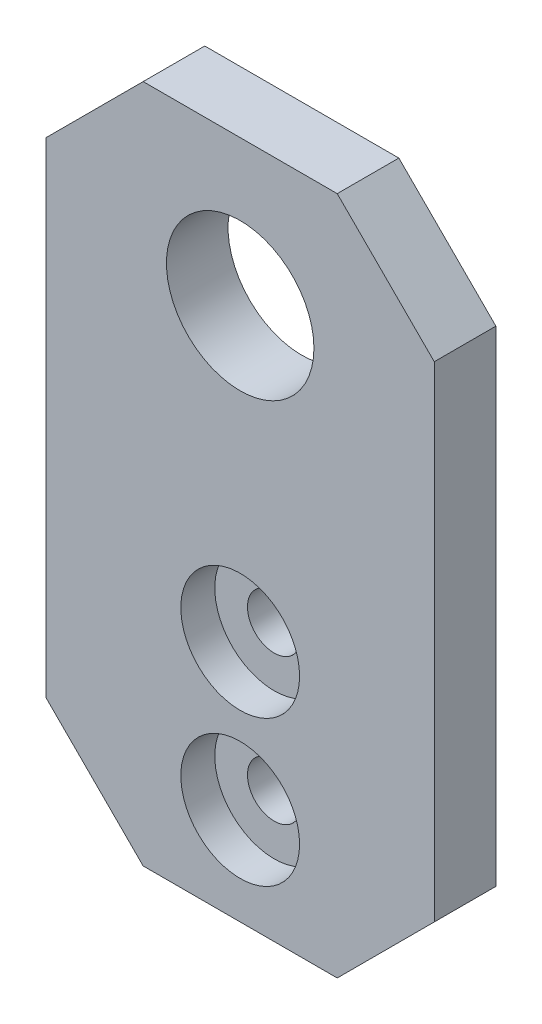
ISO-10303-21;
HEADER;
FILE_DESCRIPTION(('STEP AP214'),'2;1');
FILE_NAME('part.step','',(''),(''),'','','');
FILE_SCHEMA(('AUTOMOTIVE_DESIGN { 1 0 10303 214 1 1 1 1 }'));
ENDSEC;
DATA;
#1=APPLICATION_CONTEXT('core data for automotive mechanical design processes');
#2=APPLICATION_PROTOCOL_DEFINITION('international standard','automotive_design',2000,#1);
#3=PRODUCT_CONTEXT('',#1,'mechanical');
#4=PRODUCT('Part','Part','',(#3));
#5=PRODUCT_RELATED_PRODUCT_CATEGORY('part','',(#4));
#6=PRODUCT_DEFINITION_FORMATION('','',#4);
#7=PRODUCT_DEFINITION_CONTEXT('part definition',#1,'design');
#8=PRODUCT_DEFINITION('design','',#6,#7);
#9=PRODUCT_DEFINITION_SHAPE('','',#8);
#10=(LENGTH_UNIT() NAMED_UNIT(*) SI_UNIT(.MILLI.,.METRE.));
#11=(NAMED_UNIT(*) PLANE_ANGLE_UNIT() SI_UNIT($,.RADIAN.));
#12=(NAMED_UNIT(*) SI_UNIT($,.STERADIAN.) SOLID_ANGLE_UNIT());
#13=UNCERTAINTY_MEASURE_WITH_UNIT(LENGTH_MEASURE(1.E-05),#10,'distance_accuracy_value','');
#14=(GEOMETRIC_REPRESENTATION_CONTEXT(3) GLOBAL_UNCERTAINTY_ASSIGNED_CONTEXT((#13)) GLOBAL_UNIT_ASSIGNED_CONTEXT((#10,
#11,#12)) REPRESENTATION_CONTEXT('',''));
#15=CARTESIAN_POINT('',(0.,0.,0.));
#16=DIRECTION('',(0.,0.,1.));
#17=DIRECTION('',(1.,0.,0.));
#18=AXIS2_PLACEMENT_3D('',#15,#16,#17);
#19=CARTESIAN_POINT('',(0.,0.,6.35));
#20=DIRECTION('',(0.,0.,-1.));
#21=DIRECTION('',(-1.,0.,0.));
#22=AXIS2_PLACEMENT_3D('',#19,#20,#21);
#23=PLANE('',#22);
#24=CARTESIAN_POINT('',(0.,-10.,6.35));
#25=DIRECTION('',(0.,0.,1.));
#26=DIRECTION('',(1.,0.,0.));
#27=AXIS2_PLACEMENT_3D('',#24,#25,#26);
#28=CIRCLE('',#27,6.119);
#29=CARTESIAN_POINT('',(6.119,-10.,6.35));
#30=VERTEX_POINT('',#29);
#31=EDGE_CURVE('E214',#30,#30,#28,.T.);
#32=ORIENTED_EDGE('',*,*,#31,.F.);
#33=EDGE_LOOP('',(#32));
#34=FACE_BOUND('',#33,.T.);
#35=DIRECTION('',(1.,0.,0.));
#36=VECTOR('',#35,1.);
#37=CARTESIAN_POINT('',(-20.,-35.,6.35));
#38=LINE('',#37,#36);
#39=CARTESIAN_POINT('',(-10.,-35.,6.35));
#40=VERTEX_POINT('',#39);
#41=CARTESIAN_POINT('',(9.99999999999997,-35.,6.35));
#42=VERTEX_POINT('',#41);
#43=EDGE_CURVE('E177',#40,#42,#38,.T.);
#44=ORIENTED_EDGE('',*,*,#43,.T.);
#45=DIRECTION('',(-0.707106781186549,-0.707106781186546,0.));
#46=VECTOR('',#45,1.);
#47=CARTESIAN_POINT('',(20.,-25.,6.35));
#48=LINE('',#47,#46);
#49=CARTESIAN_POINT('',(20.,-25.,6.35));
#50=VERTEX_POINT('',#49);
#51=EDGE_CURVE('E157',#42,#50,#48,.F.);
#52=ORIENTED_EDGE('',*,*,#51,.T.);
#53=DIRECTION('',(0.,1.,0.));
#54=VECTOR('',#53,1.);
#55=CARTESIAN_POINT('',(20.,-35.,6.35));
#56=LINE('',#55,#54);
#57=CARTESIAN_POINT('',(20.,24.9999999999999,6.35));
#58=VERTEX_POINT('',#57);
#59=EDGE_CURVE('E127',#50,#58,#56,.T.);
#60=ORIENTED_EDGE('',*,*,#59,.T.);
#61=DIRECTION('',(0.707106781186546,-0.707106781186549,0.));
#62=VECTOR('',#61,1.);
#63=CARTESIAN_POINT('',(9.99999999999999,35.,6.35));
#64=LINE('',#63,#62);
#65=CARTESIAN_POINT('',(9.99999999999999,35.,6.35));
#66=VERTEX_POINT('',#65);
#67=EDGE_CURVE('E63',#58,#66,#64,.F.);
#68=ORIENTED_EDGE('',*,*,#67,.T.);
#69=DIRECTION('',(-1.,0.,0.));
#70=VECTOR('',#69,1.);
#71=CARTESIAN_POINT('',(-20.,35.,6.35));
#72=LINE('',#71,#70);
#73=CARTESIAN_POINT('',(-9.99999999999995,35.,6.35));
#74=VERTEX_POINT('',#73);
#75=EDGE_CURVE('E144',#66,#74,#72,.T.);
#76=ORIENTED_EDGE('',*,*,#75,.T.);
#77=DIRECTION('',(0.707106781186549,0.707106781186546,0.));
#78=VECTOR('',#77,1.);
#79=CARTESIAN_POINT('',(-20.,25.,6.35));
#80=LINE('',#79,#78);
#81=CARTESIAN_POINT('',(-20.,25.,6.35));
#82=VERTEX_POINT('',#81);
#83=EDGE_CURVE('E152',#74,#82,#80,.F.);
#84=ORIENTED_EDGE('',*,*,#83,.T.);
#85=DIRECTION('',(0.,-1.,0.));
#86=VECTOR('',#85,1.);
#87=CARTESIAN_POINT('',(-20.,-35.,6.35));
#88=LINE('',#87,#86);
#89=CARTESIAN_POINT('',(-20.,-25.,6.35));
#90=VERTEX_POINT('',#89);
#91=EDGE_CURVE('E138',#82,#90,#88,.T.);
#92=ORIENTED_EDGE('',*,*,#91,.T.);
#93=DIRECTION('',(-0.707106781186546,0.707106781186549,0.));
#94=VECTOR('',#93,1.);
#95=CARTESIAN_POINT('',(-9.99999999999999,-35.,6.35));
#96=LINE('',#95,#94);
#97=EDGE_CURVE('E155',#90,#40,#96,.F.);
#98=ORIENTED_EDGE('',*,*,#97,.T.);
#99=EDGE_LOOP('',(#44,#52,#60,#68,#76,#84,#92,#98));
#100=FACE_BOUND('',#99,.T.);
#101=CARTESIAN_POINT('',(0.,20.,6.35));
#102=DIRECTION('',(0.,0.,1.));
#103=DIRECTION('',(1.,0.,0.));
#104=AXIS2_PLACEMENT_3D('',#101,#102,#103);
#105=CIRCLE('',#104,7.6);
#106=CARTESIAN_POINT('',(7.6,20.,6.35));
#107=VERTEX_POINT('',#106);
#108=EDGE_CURVE('E183',#107,#107,#105,.T.);
#109=ORIENTED_EDGE('',*,*,#108,.F.);
#110=EDGE_LOOP('',(#109));
#111=FACE_BOUND('',#110,.T.);
#112=CARTESIAN_POINT('',(0.,-25.,6.35));
#113=DIRECTION('',(0.,0.,1.));
#114=DIRECTION('',(1.,0.,0.));
#115=AXIS2_PLACEMENT_3D('',#112,#113,#114);
#116=CIRCLE('',#115,6.119);
#117=CARTESIAN_POINT('',(6.119,-25.,6.35));
#118=VERTEX_POINT('',#117);
#119=EDGE_CURVE('E202',#118,#118,#116,.T.);
#120=ORIENTED_EDGE('',*,*,#119,.F.);
#121=EDGE_LOOP('',(#120));
#122=FACE_BOUND('',#121,.T.);
#123=ADVANCED_FACE('F41',(#34,#100,#111,#122),#23,.F.);
#124=CARTESIAN_POINT('',(0.,0.,0.));
#125=DIRECTION('',(0.,0.,-1.));
#126=DIRECTION('',(-1.,0.,0.));
#127=AXIS2_PLACEMENT_3D('',#124,#125,#126);
#128=PLANE('',#127);
#129=CARTESIAN_POINT('',(0.,-10.,0.));
#130=DIRECTION('',(0.,0.,1.));
#131=DIRECTION('',(1.,0.,0.));
#132=AXIS2_PLACEMENT_3D('',#129,#130,#131);
#133=CIRCLE('',#132,2.75000000000001);
#134=CARTESIAN_POINT('',(2.75000000000002,-10.,0.));
#135=VERTEX_POINT('',#134);
#136=EDGE_CURVE('E205',#135,#135,#133,.T.);
#137=ORIENTED_EDGE('',*,*,#136,.T.);
#138=EDGE_LOOP('',(#137));
#139=FACE_BOUND('',#138,.T.);
#140=CARTESIAN_POINT('',(0.,20.,0.));
#141=DIRECTION('',(0.,0.,1.));
#142=DIRECTION('',(1.,0.,0.));
#143=AXIS2_PLACEMENT_3D('',#140,#141,#142);
#144=CIRCLE('',#143,7.6);
#145=CARTESIAN_POINT('',(7.6,20.,0.));
#146=VERTEX_POINT('',#145);
#147=EDGE_CURVE('E185',#146,#146,#144,.T.);
#148=ORIENTED_EDGE('',*,*,#147,.T.);
#149=EDGE_LOOP('',(#148));
#150=FACE_BOUND('',#149,.T.);
#151=DIRECTION('',(0.,1.,0.));
#152=VECTOR('',#151,1.);
#153=CARTESIAN_POINT('',(20.,-35.,0.));
#154=LINE('',#153,#152);
#155=CARTESIAN_POINT('',(20.,-25.,0.));
#156=VERTEX_POINT('',#155);
#157=CARTESIAN_POINT('',(20.,24.9999999999999,0.));
#158=VERTEX_POINT('',#157);
#159=EDGE_CURVE('E125',#156,#158,#154,.T.);
#160=ORIENTED_EDGE('',*,*,#159,.F.);
#161=DIRECTION('',(0.707106781186549,0.707106781186546,0.));
#162=VECTOR('',#161,1.);
#163=CARTESIAN_POINT('',(22.5,-22.5,0.));
#164=LINE('',#163,#162);
#165=CARTESIAN_POINT('',(9.99999999999997,-35.,0.));
#166=VERTEX_POINT('',#165);
#167=EDGE_CURVE('E108',#156,#166,#164,.F.);
#168=ORIENTED_EDGE('',*,*,#167,.T.);
#169=DIRECTION('',(1.,0.,0.));
#170=VECTOR('',#169,1.);
#171=CARTESIAN_POINT('',(-20.,-35.,0.));
#172=LINE('',#171,#170);
#173=CARTESIAN_POINT('',(-10.,-35.,0.));
#174=VERTEX_POINT('',#173);
#175=EDGE_CURVE('E136',#174,#166,#172,.T.);
#176=ORIENTED_EDGE('',*,*,#175,.F.);
#177=DIRECTION('',(0.707106781186546,-0.707106781186549,0.));
#178=VECTOR('',#177,1.);
#179=CARTESIAN_POINT('',(-22.5,-22.4999999999999,0.));
#180=LINE('',#179,#178);
#181=CARTESIAN_POINT('',(-20.,-25.,0.));
#182=VERTEX_POINT('',#181);
#183=EDGE_CURVE('E119',#174,#182,#180,.F.);
#184=ORIENTED_EDGE('',*,*,#183,.T.);
#185=DIRECTION('',(0.,-1.,0.));
#186=VECTOR('',#185,1.);
#187=CARTESIAN_POINT('',(-20.,-35.,0.));
#188=LINE('',#187,#186);
#189=CARTESIAN_POINT('',(-20.,25.,0.));
#190=VERTEX_POINT('',#189);
#191=EDGE_CURVE('E140',#190,#182,#188,.T.);
#192=ORIENTED_EDGE('',*,*,#191,.F.);
#193=DIRECTION('',(-0.707106781186549,-0.707106781186546,0.));
#194=VECTOR('',#193,1.);
#195=CARTESIAN_POINT('',(-22.5,22.5,0.));
#196=LINE('',#195,#194);
#197=CARTESIAN_POINT('',(-9.99999999999995,35.,0.));
#198=VERTEX_POINT('',#197);
#199=EDGE_CURVE('E128',#190,#198,#196,.F.);
#200=ORIENTED_EDGE('',*,*,#199,.T.);
#201=DIRECTION('',(-1.,0.,0.));
#202=VECTOR('',#201,1.);
#203=CARTESIAN_POINT('',(-20.,35.,0.));
#204=LINE('',#203,#202);
#205=CARTESIAN_POINT('',(9.99999999999999,35.,0.));
#206=VERTEX_POINT('',#205);
#207=EDGE_CURVE('E135',#206,#198,#204,.T.);
#208=ORIENTED_EDGE('',*,*,#207,.F.);
#209=DIRECTION('',(-0.707106781186546,0.707106781186549,0.));
#210=VECTOR('',#209,1.);
#211=CARTESIAN_POINT('',(22.5,22.4999999999999,0.));
#212=LINE('',#211,#210);
#213=EDGE_CURVE('E134',#206,#158,#212,.F.);
#214=ORIENTED_EDGE('',*,*,#213,.T.);
#215=EDGE_LOOP('',(#160,#168,#176,#184,#192,#200,#208,#214));
#216=FACE_BOUND('',#215,.T.);
#217=CARTESIAN_POINT('',(0.,-25.,0.));
#218=DIRECTION('',(0.,0.,1.));
#219=DIRECTION('',(1.,0.,0.));
#220=AXIS2_PLACEMENT_3D('',#217,#218,#219);
#221=CIRCLE('',#220,2.75000000000001);
#222=CARTESIAN_POINT('',(2.75000000000002,-25.,0.));
#223=VERTEX_POINT('',#222);
#224=EDGE_CURVE('E192',#223,#223,#221,.T.);
#225=ORIENTED_EDGE('',*,*,#224,.T.);
#226=EDGE_LOOP('',(#225));
#227=FACE_BOUND('',#226,.T.);
#228=ADVANCED_FACE('F131',(#139,#150,#216,#227),#128,.T.);
#229=CARTESIAN_POINT('',(-20.,-35.,6.35));
#230=DIRECTION('',(1.,0.,0.));
#231=DIRECTION('',(0.,0.,-1.));
#232=AXIS2_PLACEMENT_3D('',#229,#230,#231);
#233=PLANE('',#232);
#234=ORIENTED_EDGE('',*,*,#191,.T.);
#235=DIRECTION('',(0.,0.,1.));
#236=VECTOR('',#235,1.);
#237=CARTESIAN_POINT('',(-20.,-25.,6.35));
#238=LINE('',#237,#236);
#239=EDGE_CURVE('E162',#182,#90,#238,.T.);
#240=ORIENTED_EDGE('',*,*,#239,.T.);
#241=ORIENTED_EDGE('',*,*,#91,.F.);
#242=DIRECTION('',(0.,0.,-1.));
#243=VECTOR('',#242,1.);
#244=CARTESIAN_POINT('',(-20.,25.,6.35));
#245=LINE('',#244,#243);
#246=EDGE_CURVE('E159',#82,#190,#245,.T.);
#247=ORIENTED_EDGE('',*,*,#246,.T.);
#248=EDGE_LOOP('',(#234,#240,#241,#247));
#249=FACE_BOUND('',#248,.T.);
#250=ADVANCED_FACE('F168',(#249),#233,.F.);
#251=CARTESIAN_POINT('',(-20.,-35.,6.35));
#252=DIRECTION('',(0.,1.,0.));
#253=DIRECTION('',(-1.,0.,0.));
#254=AXIS2_PLACEMENT_3D('',#251,#252,#253);
#255=PLANE('',#254);
#256=ORIENTED_EDGE('',*,*,#175,.T.);
#257=DIRECTION('',(0.,0.,1.));
#258=VECTOR('',#257,1.);
#259=CARTESIAN_POINT('',(9.99999999999997,-35.,6.35));
#260=LINE('',#259,#258);
#261=EDGE_CURVE('E113',#166,#42,#260,.T.);
#262=ORIENTED_EDGE('',*,*,#261,.T.);
#263=ORIENTED_EDGE('',*,*,#43,.F.);
#264=DIRECTION('',(0.,0.,-1.));
#265=VECTOR('',#264,1.);
#266=CARTESIAN_POINT('',(-10.,-35.,6.35));
#267=LINE('',#266,#265);
#268=EDGE_CURVE('E118',#40,#174,#267,.T.);
#269=ORIENTED_EDGE('',*,*,#268,.T.);
#270=EDGE_LOOP('',(#256,#262,#263,#269));
#271=FACE_BOUND('',#270,.T.);
#272=ADVANCED_FACE('F182',(#271),#255,.F.);
#273=CARTESIAN_POINT('',(20.,-35.,6.35));
#274=DIRECTION('',(-1.,0.,0.));
#275=DIRECTION('',(0.,-1.,0.));
#276=AXIS2_PLACEMENT_3D('',#273,#274,#275);
#277=PLANE('',#276);
#278=ORIENTED_EDGE('',*,*,#59,.F.);
#279=DIRECTION('',(0.,0.,-1.));
#280=VECTOR('',#279,1.);
#281=CARTESIAN_POINT('',(20.,-25.,6.35));
#282=LINE('',#281,#280);
#283=EDGE_CURVE('E112',#50,#156,#282,.T.);
#284=ORIENTED_EDGE('',*,*,#283,.T.);
#285=ORIENTED_EDGE('',*,*,#159,.T.);
#286=DIRECTION('',(0.,0.,1.));
#287=VECTOR('',#286,1.);
#288=CARTESIAN_POINT('',(20.,24.9999999999999,6.35));
#289=LINE('',#288,#287);
#290=EDGE_CURVE('E129',#158,#58,#289,.T.);
#291=ORIENTED_EDGE('',*,*,#290,.T.);
#292=EDGE_LOOP('',(#278,#284,#285,#291));
#293=FACE_BOUND('',#292,.T.);
#294=ADVANCED_FACE('F124',(#293),#277,.F.);
#295=CARTESIAN_POINT('',(-20.,35.,6.35));
#296=DIRECTION('',(0.,-1.,0.));
#297=DIRECTION('',(0.,0.,-1.));
#298=AXIS2_PLACEMENT_3D('',#295,#296,#297);
#299=PLANE('',#298);
#300=ORIENTED_EDGE('',*,*,#75,.F.);
#301=DIRECTION('',(0.,0.,-1.));
#302=VECTOR('',#301,1.);
#303=CARTESIAN_POINT('',(9.99999999999999,35.,6.35));
#304=LINE('',#303,#302);
#305=EDGE_CURVE('E11',#66,#206,#304,.T.);
#306=ORIENTED_EDGE('',*,*,#305,.T.);
#307=ORIENTED_EDGE('',*,*,#207,.T.);
#308=DIRECTION('',(0.,0.,1.));
#309=VECTOR('',#308,1.);
#310=CARTESIAN_POINT('',(-9.99999999999995,35.,6.35));
#311=LINE('',#310,#309);
#312=EDGE_CURVE('E50',#198,#74,#311,.T.);
#313=ORIENTED_EDGE('',*,*,#312,.T.);
#314=EDGE_LOOP('',(#300,#306,#307,#313));
#315=FACE_BOUND('',#314,.T.);
#316=ADVANCED_FACE('F231',(#315),#299,.F.);
#317=CARTESIAN_POINT('',(0.,20.,6.35));
#318=DIRECTION('',(0.,0.,-1.));
#319=DIRECTION('',(-1.,0.,0.));
#320=AXIS2_PLACEMENT_3D('',#317,#318,#319);
#321=CYLINDRICAL_SURFACE('',#320,7.6);
#322=ORIENTED_EDGE('',*,*,#108,.T.);
#323=EDGE_LOOP('',(#322));
#324=FACE_BOUND('',#323,.T.);
#325=ORIENTED_EDGE('',*,*,#147,.F.);
#326=EDGE_LOOP('',(#325));
#327=FACE_BOUND('',#326,.T.);
#328=ADVANCED_FACE('F228',(#324,#327),#321,.F.);
#329=CARTESIAN_POINT('',(0.,-25.,6.35));
#330=DIRECTION('',(0.,0.,1.));
#331=DIRECTION('',(1.,0.,0.));
#332=AXIS2_PLACEMENT_3D('',#329,#330,#331);
#333=CYLINDRICAL_SURFACE('',#332,2.75);
#334=ORIENTED_EDGE('',*,*,#224,.F.);
#335=EDGE_LOOP('',(#334));
#336=FACE_BOUND('',#335,.T.);
#337=CARTESIAN_POINT('',(0.,-25.,2.85));
#338=DIRECTION('',(0.,0.,1.));
#339=DIRECTION('',(1.,0.,0.));
#340=AXIS2_PLACEMENT_3D('',#337,#338,#339);
#341=CIRCLE('',#340,2.75);
#342=CARTESIAN_POINT('',(2.75000000000001,-25.,2.85));
#343=VERTEX_POINT('',#342);
#344=EDGE_CURVE('E196',#343,#343,#341,.T.);
#345=ORIENTED_EDGE('',*,*,#344,.T.);
#346=EDGE_LOOP('',(#345));
#347=FACE_BOUND('',#346,.T.);
#348=ADVANCED_FACE('F377',(#336,#347),#333,.F.);
#349=CARTESIAN_POINT('',(2.75000000000001,-25.,2.85));
#350=DIRECTION('',(0.,0.,-1.));
#351=DIRECTION('',(-1.,0.,0.));
#352=AXIS2_PLACEMENT_3D('',#349,#350,#351);
#353=PLANE('',#352);
#354=ORIENTED_EDGE('',*,*,#344,.F.);
#355=EDGE_LOOP('',(#354));
#356=FACE_BOUND('',#355,.T.);
#357=CARTESIAN_POINT('',(0.,-25.,2.85));
#358=DIRECTION('',(0.,0.,1.));
#359=DIRECTION('',(1.,0.,0.));
#360=AXIS2_PLACEMENT_3D('',#357,#358,#359);
#361=CIRCLE('',#360,6.119);
#362=CARTESIAN_POINT('',(6.119,-25.,2.85));
#363=VERTEX_POINT('',#362);
#364=EDGE_CURVE('E199',#363,#363,#361,.T.);
#365=ORIENTED_EDGE('',*,*,#364,.T.);
#366=EDGE_LOOP('',(#365));
#367=FACE_BOUND('',#366,.T.);
#368=ADVANCED_FACE('F366',(#356,#367),#353,.F.);
#369=CARTESIAN_POINT('',(0.,-25.,6.35));
#370=DIRECTION('',(0.,0.,1.));
#371=DIRECTION('',(1.,0.,0.));
#372=AXIS2_PLACEMENT_3D('',#369,#370,#371);
#373=CYLINDRICAL_SURFACE('',#372,6.119);
#374=ORIENTED_EDGE('',*,*,#364,.F.);
#375=EDGE_LOOP('',(#374));
#376=FACE_BOUND('',#375,.T.);
#377=ORIENTED_EDGE('',*,*,#119,.T.);
#378=EDGE_LOOP('',(#377));
#379=FACE_BOUND('',#378,.T.);
#380=ADVANCED_FACE('F355',(#376,#379),#373,.F.);
#381=CARTESIAN_POINT('',(0.,-10.,6.35));
#382=DIRECTION('',(0.,0.,1.));
#383=DIRECTION('',(1.,0.,0.));
#384=AXIS2_PLACEMENT_3D('',#381,#382,#383);
#385=CYLINDRICAL_SURFACE('',#384,2.75);
#386=ORIENTED_EDGE('',*,*,#136,.F.);
#387=EDGE_LOOP('',(#386));
#388=FACE_BOUND('',#387,.T.);
#389=CARTESIAN_POINT('',(0.,-10.,2.85));
#390=DIRECTION('',(0.,0.,1.));
#391=DIRECTION('',(1.,0.,0.));
#392=AXIS2_PLACEMENT_3D('',#389,#390,#391);
#393=CIRCLE('',#392,2.75);
#394=CARTESIAN_POINT('',(2.75,-10.,2.85));
#395=VERTEX_POINT('',#394);
#396=EDGE_CURVE('E208',#395,#395,#393,.T.);
#397=ORIENTED_EDGE('',*,*,#396,.T.);
#398=EDGE_LOOP('',(#397));
#399=FACE_BOUND('',#398,.T.);
#400=ADVANCED_FACE('F344',(#388,#399),#385,.F.);
#401=CARTESIAN_POINT('',(2.75,-10.,2.85));
#402=DIRECTION('',(0.,0.,-1.));
#403=DIRECTION('',(-1.,0.,0.));
#404=AXIS2_PLACEMENT_3D('',#401,#402,#403);
#405=PLANE('',#404);
#406=ORIENTED_EDGE('',*,*,#396,.F.);
#407=EDGE_LOOP('',(#406));
#408=FACE_BOUND('',#407,.T.);
#409=CARTESIAN_POINT('',(0.,-10.,2.85));
#410=DIRECTION('',(0.,0.,1.));
#411=DIRECTION('',(1.,0.,0.));
#412=AXIS2_PLACEMENT_3D('',#409,#410,#411);
#413=CIRCLE('',#412,6.119);
#414=CARTESIAN_POINT('',(6.119,-10.,2.85));
#415=VERTEX_POINT('',#414);
#416=EDGE_CURVE('E211',#415,#415,#413,.T.);
#417=ORIENTED_EDGE('',*,*,#416,.T.);
#418=EDGE_LOOP('',(#417));
#419=FACE_BOUND('',#418,.T.);
#420=ADVANCED_FACE('F333',(#408,#419),#405,.F.);
#421=CARTESIAN_POINT('',(0.,-10.,6.35));
#422=DIRECTION('',(0.,0.,1.));
#423=DIRECTION('',(1.,0.,0.));
#424=AXIS2_PLACEMENT_3D('',#421,#422,#423);
#425=CYLINDRICAL_SURFACE('',#424,6.119);
#426=ORIENTED_EDGE('',*,*,#416,.F.);
#427=EDGE_LOOP('',(#426));
#428=FACE_BOUND('',#427,.T.);
#429=ORIENTED_EDGE('',*,*,#31,.T.);
#430=EDGE_LOOP('',(#429));
#431=FACE_BOUND('',#430,.T.);
#432=ADVANCED_FACE('F218',(#428,#431),#425,.F.);
#433=CARTESIAN_POINT('',(20.,-25.,6.35));
#434=DIRECTION('',(-0.707106781186546,0.707106781186549,0.));
#435=DIRECTION('',(0.,0.,-1.));
#436=AXIS2_PLACEMENT_3D('',#433,#434,#435);
#437=PLANE('',#436);
#438=ORIENTED_EDGE('',*,*,#51,.F.);
#439=ORIENTED_EDGE('',*,*,#261,.F.);
#440=ORIENTED_EDGE('',*,*,#167,.F.);
#441=ORIENTED_EDGE('',*,*,#283,.F.);
#442=EDGE_LOOP('',(#438,#439,#440,#441));
#443=FACE_BOUND('',#442,.T.);
#444=ADVANCED_FACE('F111',(#443),#437,.F.);
#445=CARTESIAN_POINT('',(-9.99999999999999,-35.,6.35));
#446=DIRECTION('',(0.707106781186549,0.707106781186546,0.));
#447=DIRECTION('',(0.,0.,-1.));
#448=AXIS2_PLACEMENT_3D('',#445,#446,#447);
#449=PLANE('',#448);
#450=ORIENTED_EDGE('',*,*,#97,.F.);
#451=ORIENTED_EDGE('',*,*,#239,.F.);
#452=ORIENTED_EDGE('',*,*,#183,.F.);
#453=ORIENTED_EDGE('',*,*,#268,.F.);
#454=EDGE_LOOP('',(#450,#451,#452,#453));
#455=FACE_BOUND('',#454,.T.);
#456=ADVANCED_FACE('F180',(#455),#449,.F.);
#457=CARTESIAN_POINT('',(9.99999999999999,35.,6.35));
#458=DIRECTION('',(-0.707106781186549,-0.707106781186546,0.));
#459=DIRECTION('',(0.,0.,-1.));
#460=AXIS2_PLACEMENT_3D('',#457,#458,#459);
#461=PLANE('',#460);
#462=ORIENTED_EDGE('',*,*,#67,.F.);
#463=ORIENTED_EDGE('',*,*,#290,.F.);
#464=ORIENTED_EDGE('',*,*,#213,.F.);
#465=ORIENTED_EDGE('',*,*,#305,.F.);
#466=EDGE_LOOP('',(#462,#463,#464,#465));
#467=FACE_BOUND('',#466,.T.);
#468=ADVANCED_FACE('F250',(#467),#461,.F.);
#469=CARTESIAN_POINT('',(-20.,25.,6.35));
#470=DIRECTION('',(0.707106781186546,-0.707106781186549,0.));
#471=DIRECTION('',(0.,0.,-1.));
#472=AXIS2_PLACEMENT_3D('',#469,#470,#471);
#473=PLANE('',#472);
#474=ORIENTED_EDGE('',*,*,#83,.F.);
#475=ORIENTED_EDGE('',*,*,#312,.F.);
#476=ORIENTED_EDGE('',*,*,#199,.F.);
#477=ORIENTED_EDGE('',*,*,#246,.F.);
#478=EDGE_LOOP('',(#474,#475,#476,#477));
#479=FACE_BOUND('',#478,.T.);
#480=ADVANCED_FACE('F44',(#479),#473,.F.);
#481=CLOSED_SHELL('',(#123,#228,#250,#272,#294,#316,#328,#348,#368,#380,#400,#420,#432,#444,
#456,#468,#480));
#482=MANIFOLD_SOLID_BREP('B2',#481);
#483=ADVANCED_BREP_SHAPE_REPRESENTATION('',(#18,#482),#14);
#484=SHAPE_DEFINITION_REPRESENTATION(#9,#483);
ENDSEC;
END-ISO-10303-21;
